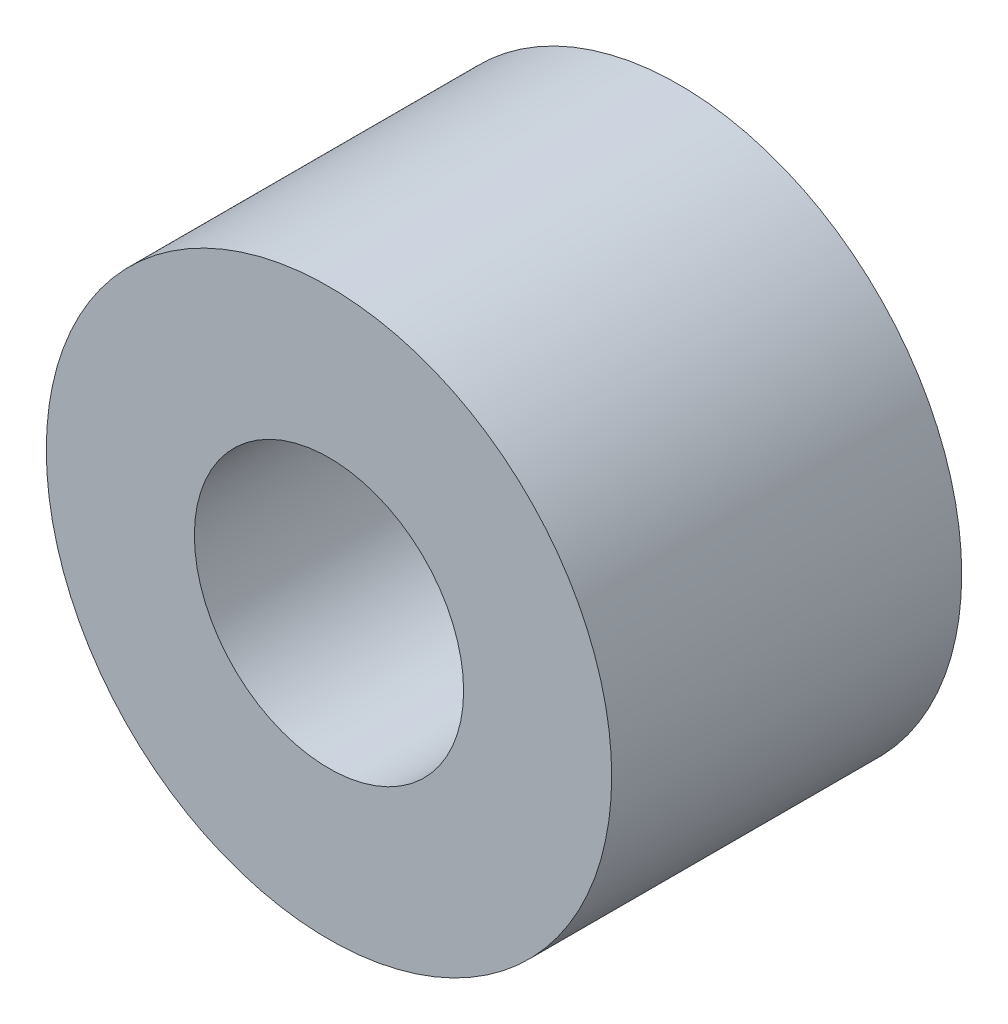
ISO-10303-21;
HEADER;
FILE_DESCRIPTION(('STEP AP214'),'2;1');
FILE_NAME('part.step','',(''),(''),'','','');
FILE_SCHEMA(('AUTOMOTIVE_DESIGN { 1 0 10303 214 1 1 1 1 }'));
ENDSEC;
DATA;
#1=APPLICATION_CONTEXT('core data for automotive mechanical design processes');
#2=APPLICATION_PROTOCOL_DEFINITION('international standard','automotive_design',2000,#1);
#3=PRODUCT_CONTEXT('',#1,'mechanical');
#4=PRODUCT('Part','Part','',(#3));
#5=PRODUCT_RELATED_PRODUCT_CATEGORY('part','',(#4));
#6=PRODUCT_DEFINITION_FORMATION('','',#4);
#7=PRODUCT_DEFINITION_CONTEXT('part definition',#1,'design');
#8=PRODUCT_DEFINITION('design','',#6,#7);
#9=PRODUCT_DEFINITION_SHAPE('','',#8);
#10=(LENGTH_UNIT() NAMED_UNIT(*) SI_UNIT(.MILLI.,.METRE.));
#11=(NAMED_UNIT(*) PLANE_ANGLE_UNIT() SI_UNIT($,.RADIAN.));
#12=(NAMED_UNIT(*) SI_UNIT($,.STERADIAN.) SOLID_ANGLE_UNIT());
#13=UNCERTAINTY_MEASURE_WITH_UNIT(LENGTH_MEASURE(1.E-05),#10,'distance_accuracy_value','');
#14=(GEOMETRIC_REPRESENTATION_CONTEXT(3) GLOBAL_UNCERTAINTY_ASSIGNED_CONTEXT((#13)) GLOBAL_UNIT_ASSIGNED_CONTEXT((#10,
#11,#12)) REPRESENTATION_CONTEXT('',''));
#15=CARTESIAN_POINT('',(0.,0.,0.));
#16=DIRECTION('',(0.,0.,1.));
#17=DIRECTION('',(1.,0.,0.));
#18=AXIS2_PLACEMENT_3D('',#15,#16,#17);
#19=CARTESIAN_POINT('',(0.,0.,26.));
#20=DIRECTION('',(0.,0.,1.));
#21=DIRECTION('',(1.,0.,0.));
#22=AXIS2_PLACEMENT_3D('',#19,#20,#21);
#23=PLANE('',#22);
#24=CARTESIAN_POINT('',(0.,0.,26.));
#25=DIRECTION('',(0.,0.,1.));
#26=DIRECTION('',(1.,0.,0.));
#27=AXIS2_PLACEMENT_3D('',#24,#25,#26);
#28=CIRCLE('',#27,21.);
#29=CARTESIAN_POINT('',(-21.,0.,26.));
#30=VERTEX_POINT('',#29);
#31=EDGE_CURVE('E10',#30,#30,#28,.T.);
#32=ORIENTED_EDGE('',*,*,#31,.T.);
#33=EDGE_LOOP('',(#32));
#34=FACE_BOUND('',#33,.T.);
#35=CARTESIAN_POINT('',(0.,0.,26.));
#36=DIRECTION('',(0.,0.,1.));
#37=DIRECTION('',(1.,0.,0.));
#38=AXIS2_PLACEMENT_3D('',#35,#36,#37);
#39=CIRCLE('',#38,10.);
#40=CARTESIAN_POINT('',(-10.,0.,26.));
#41=VERTEX_POINT('',#40);
#42=EDGE_CURVE('E41',#41,#41,#39,.T.);
#43=ORIENTED_EDGE('',*,*,#42,.F.);
#44=EDGE_LOOP('',(#43));
#45=FACE_BOUND('',#44,.T.);
#46=ADVANCED_FACE('F30',(#34,#45),#23,.T.);
#47=CARTESIAN_POINT('',(0.,0.,0.));
#48=DIRECTION('',(0.,0.,1.));
#49=DIRECTION('',(1.,0.,0.));
#50=AXIS2_PLACEMENT_3D('',#47,#48,#49);
#51=PLANE('',#50);
#52=CARTESIAN_POINT('',(0.,0.,0.));
#53=DIRECTION('',(0.,0.,1.));
#54=DIRECTION('',(1.,0.,0.));
#55=AXIS2_PLACEMENT_3D('',#52,#53,#54);
#56=CIRCLE('',#55,21.);
#57=CARTESIAN_POINT('',(-21.,0.,0.));
#58=VERTEX_POINT('',#57);
#59=EDGE_CURVE('E34',#58,#58,#56,.T.);
#60=ORIENTED_EDGE('',*,*,#59,.F.);
#61=EDGE_LOOP('',(#60));
#62=FACE_BOUND('',#61,.T.);
#63=CARTESIAN_POINT('',(0.,0.,0.));
#64=DIRECTION('',(0.,0.,1.));
#65=DIRECTION('',(1.,0.,0.));
#66=AXIS2_PLACEMENT_3D('',#63,#64,#65);
#67=CIRCLE('',#66,10.);
#68=CARTESIAN_POINT('',(-10.,0.,0.));
#69=VERTEX_POINT('',#68);
#70=EDGE_CURVE('E43',#69,#69,#67,.T.);
#71=ORIENTED_EDGE('',*,*,#70,.T.);
#72=EDGE_LOOP('',(#71));
#73=FACE_BOUND('',#72,.T.);
#74=ADVANCED_FACE('F53',(#62,#73),#51,.F.);
#75=CARTESIAN_POINT('',(0.,0.,26.));
#76=DIRECTION('',(0.,0.,-1.));
#77=DIRECTION('',(-1.,0.,0.));
#78=AXIS2_PLACEMENT_3D('',#75,#76,#77);
#79=CYLINDRICAL_SURFACE('',#78,21.);
#80=CARTESIAN_POINT('',(-21.,0.,26.));
#81=CARTESIAN_POINT('',(-21.,0.,25.7291666666667));
#82=CARTESIAN_POINT('',(-21.,0.,25.4583333333333));
#83=CARTESIAN_POINT('',(-21.,0.,24.9166666666667));
#84=CARTESIAN_POINT('',(-21.,0.,24.6458333333333));
#85=CARTESIAN_POINT('',(-21.,0.,24.1041666666667));
#86=CARTESIAN_POINT('',(-21.,0.,23.8333333333333));
#87=CARTESIAN_POINT('',(-21.,0.,23.2916666666667));
#88=CARTESIAN_POINT('',(-21.,0.,23.0208333333333));
#89=CARTESIAN_POINT('',(-21.,0.,22.4791666666667));
#90=CARTESIAN_POINT('',(-21.,0.,22.2083333333333));
#91=CARTESIAN_POINT('',(-21.,0.,21.6666666666667));
#92=CARTESIAN_POINT('',(-21.,0.,21.3958333333333));
#93=CARTESIAN_POINT('',(-21.,0.,20.8541666666667));
#94=CARTESIAN_POINT('',(-21.,0.,20.5833333333333));
#95=CARTESIAN_POINT('',(-21.,0.,20.0416666666667));
#96=CARTESIAN_POINT('',(-21.,0.,19.7708333333333));
#97=CARTESIAN_POINT('',(-21.,0.,19.2291666666667));
#98=CARTESIAN_POINT('',(-21.,0.,18.9583333333333));
#99=CARTESIAN_POINT('',(-21.,0.,18.4166666666667));
#100=CARTESIAN_POINT('',(-21.,0.,18.1458333333333));
#101=CARTESIAN_POINT('',(-21.,0.,17.6041666666667));
#102=CARTESIAN_POINT('',(-21.,0.,17.3333333333333));
#103=CARTESIAN_POINT('',(-21.,0.,16.7916666666667));
#104=CARTESIAN_POINT('',(-21.,0.,16.5208333333333));
#105=CARTESIAN_POINT('',(-21.,0.,15.9791666666667));
#106=CARTESIAN_POINT('',(-21.,0.,15.7083333333333));
#107=CARTESIAN_POINT('',(-21.,0.,15.1666666666667));
#108=CARTESIAN_POINT('',(-21.,0.,14.8958333333333));
#109=CARTESIAN_POINT('',(-21.,0.,14.3541666666667));
#110=CARTESIAN_POINT('',(-21.,0.,14.0833333333333));
#111=CARTESIAN_POINT('',(-21.,0.,13.5416666666667));
#112=CARTESIAN_POINT('',(-21.,0.,13.2708333333333));
#113=CARTESIAN_POINT('',(-21.,0.,12.7291666666667));
#114=CARTESIAN_POINT('',(-21.,0.,12.4583333333333));
#115=CARTESIAN_POINT('',(-21.,0.,11.9166666666667));
#116=CARTESIAN_POINT('',(-21.,0.,11.6458333333333));
#117=CARTESIAN_POINT('',(-21.,0.,11.1041666666667));
#118=CARTESIAN_POINT('',(-21.,0.,10.8333333333333));
#119=CARTESIAN_POINT('',(-21.,0.,10.2916666666667));
#120=CARTESIAN_POINT('',(-21.,0.,10.0208333333333));
#121=CARTESIAN_POINT('',(-21.,0.,9.47916666666667));
#122=CARTESIAN_POINT('',(-21.,0.,9.20833333333333));
#123=CARTESIAN_POINT('',(-21.,0.,8.66666666666667));
#124=CARTESIAN_POINT('',(-21.,0.,8.39583333333333));
#125=CARTESIAN_POINT('',(-21.,0.,7.85416666666667));
#126=CARTESIAN_POINT('',(-21.,0.,7.58333333333333));
#127=CARTESIAN_POINT('',(-21.,0.,7.04166666666667));
#128=CARTESIAN_POINT('',(-21.,0.,6.77083333333333));
#129=CARTESIAN_POINT('',(-21.,0.,6.22916666666667));
#130=CARTESIAN_POINT('',(-21.,0.,5.95833333333333));
#131=CARTESIAN_POINT('',(-21.,0.,5.41666666666667));
#132=CARTESIAN_POINT('',(-21.,0.,5.14583333333333));
#133=CARTESIAN_POINT('',(-21.,0.,4.60416666666667));
#134=CARTESIAN_POINT('',(-21.,0.,4.33333333333333));
#135=CARTESIAN_POINT('',(-21.,0.,3.79166666666667));
#136=CARTESIAN_POINT('',(-21.,0.,3.52083333333333));
#137=CARTESIAN_POINT('',(-21.,0.,2.97916666666667));
#138=CARTESIAN_POINT('',(-21.,0.,2.70833333333333));
#139=CARTESIAN_POINT('',(-21.,0.,2.16666666666667));
#140=CARTESIAN_POINT('',(-21.,0.,1.89583333333333));
#141=CARTESIAN_POINT('',(-21.,0.,1.35416666666667));
#142=CARTESIAN_POINT('',(-21.,0.,1.08333333333333));
#143=CARTESIAN_POINT('',(-21.,0.,0.541666666666667));
#144=CARTESIAN_POINT('',(-21.,0.,0.270833333333334));
#145=CARTESIAN_POINT('',(-21.,0.,0.));
#146=B_SPLINE_CURVE_WITH_KNOTS('',3,(#80,#81,#82,#83,#84,#85,#86,#87,#88,#89,#90,#91,#92,#93,
#94,#95,#96,#97,#98,#99,#100,#101,#102,#103,#104,#105,#106,#107,#108,#109,#110,#111,#112,#113,
#114,#115,#116,#117,#118,#119,#120,#121,#122,#123,#124,#125,#126,#127,#128,#129,#130,#131,#132,
#133,#134,#135,#136,#137,#138,#139,#140,#141,#142,#143,#144,#145),.UNSPECIFIED.,.F.,.F.,(4,2,2,
2,2,2,2,2,2,2,2,2,2,2,2,2,2,2,2,2,2,2,2,2,2,2,2,2,2,2,2,2,4),(0.,0.812499999999997,1.625,2.4375,
3.25,4.0625,4.875,5.6875,6.5,7.3125,8.125,8.93749999999999,9.74999999999999,10.5625,11.375,
12.1875,13.,13.8125,14.625,15.4375,16.25,17.0625,17.875,18.6875,19.5,20.3125,21.125,21.9375,
22.75,23.5625,24.375,25.1875,26.),.UNSPECIFIED.);
#147=EDGE_CURVE('BSEAM32',#30,#58,#146,.T.);
#148=ORIENTED_EDGE('',*,*,#31,.F.);
#149=ORIENTED_EDGE('',*,*,#59,.T.);
#150=ORIENTED_EDGE('',*,*,#147,.T.);
#151=ORIENTED_EDGE('',*,*,#147,.F.);
#152=EDGE_LOOP('',(#148,#150,#149,#151));
#153=FACE_BOUND('',#152,.T.);
#154=ADVANCED_FACE('F32',(#153),#79,.T.);
#155=CARTESIAN_POINT('',(0.,0.,26.));
#156=DIRECTION('',(0.,0.,-1.));
#157=DIRECTION('',(-1.,0.,0.));
#158=AXIS2_PLACEMENT_3D('',#155,#156,#157);
#159=CYLINDRICAL_SURFACE('',#158,10.);
#160=CARTESIAN_POINT('',(-10.,0.,26.));
#161=CARTESIAN_POINT('',(-10.,0.,25.7291666666667));
#162=CARTESIAN_POINT('',(-10.,0.,25.4583333333333));
#163=CARTESIAN_POINT('',(-10.,0.,24.9166666666667));
#164=CARTESIAN_POINT('',(-10.,0.,24.6458333333333));
#165=CARTESIAN_POINT('',(-10.,0.,24.1041666666667));
#166=CARTESIAN_POINT('',(-10.,0.,23.8333333333333));
#167=CARTESIAN_POINT('',(-10.,0.,23.2916666666667));
#168=CARTESIAN_POINT('',(-10.,0.,23.0208333333333));
#169=CARTESIAN_POINT('',(-10.,0.,22.4791666666667));
#170=CARTESIAN_POINT('',(-10.,0.,22.2083333333333));
#171=CARTESIAN_POINT('',(-10.,0.,21.6666666666667));
#172=CARTESIAN_POINT('',(-10.,0.,21.3958333333333));
#173=CARTESIAN_POINT('',(-10.,0.,20.8541666666667));
#174=CARTESIAN_POINT('',(-10.,0.,20.5833333333333));
#175=CARTESIAN_POINT('',(-10.,0.,20.0416666666667));
#176=CARTESIAN_POINT('',(-10.,0.,19.7708333333333));
#177=CARTESIAN_POINT('',(-10.,0.,19.2291666666667));
#178=CARTESIAN_POINT('',(-10.,0.,18.9583333333333));
#179=CARTESIAN_POINT('',(-10.,0.,18.4166666666667));
#180=CARTESIAN_POINT('',(-10.,0.,18.1458333333333));
#181=CARTESIAN_POINT('',(-10.,0.,17.6041666666667));
#182=CARTESIAN_POINT('',(-10.,0.,17.3333333333333));
#183=CARTESIAN_POINT('',(-10.,0.,16.7916666666667));
#184=CARTESIAN_POINT('',(-10.,0.,16.5208333333333));
#185=CARTESIAN_POINT('',(-10.,0.,15.9791666666667));
#186=CARTESIAN_POINT('',(-10.,0.,15.7083333333333));
#187=CARTESIAN_POINT('',(-10.,0.,15.1666666666667));
#188=CARTESIAN_POINT('',(-10.,0.,14.8958333333333));
#189=CARTESIAN_POINT('',(-10.,0.,14.3541666666667));
#190=CARTESIAN_POINT('',(-10.,0.,14.0833333333333));
#191=CARTESIAN_POINT('',(-10.,0.,13.5416666666667));
#192=CARTESIAN_POINT('',(-10.,0.,13.2708333333333));
#193=CARTESIAN_POINT('',(-10.,0.,12.7291666666667));
#194=CARTESIAN_POINT('',(-10.,0.,12.4583333333333));
#195=CARTESIAN_POINT('',(-10.,0.,11.9166666666667));
#196=CARTESIAN_POINT('',(-10.,0.,11.6458333333333));
#197=CARTESIAN_POINT('',(-10.,0.,11.1041666666667));
#198=CARTESIAN_POINT('',(-10.,0.,10.8333333333333));
#199=CARTESIAN_POINT('',(-10.,0.,10.2916666666667));
#200=CARTESIAN_POINT('',(-10.,0.,10.0208333333333));
#201=CARTESIAN_POINT('',(-10.,0.,9.47916666666667));
#202=CARTESIAN_POINT('',(-10.,0.,9.20833333333333));
#203=CARTESIAN_POINT('',(-10.,0.,8.66666666666667));
#204=CARTESIAN_POINT('',(-10.,0.,8.39583333333333));
#205=CARTESIAN_POINT('',(-10.,0.,7.85416666666667));
#206=CARTESIAN_POINT('',(-10.,0.,7.58333333333333));
#207=CARTESIAN_POINT('',(-10.,0.,7.04166666666667));
#208=CARTESIAN_POINT('',(-10.,0.,6.77083333333333));
#209=CARTESIAN_POINT('',(-10.,0.,6.22916666666667));
#210=CARTESIAN_POINT('',(-10.,0.,5.95833333333333));
#211=CARTESIAN_POINT('',(-10.,0.,5.41666666666667));
#212=CARTESIAN_POINT('',(-10.,0.,5.14583333333333));
#213=CARTESIAN_POINT('',(-10.,0.,4.60416666666667));
#214=CARTESIAN_POINT('',(-10.,0.,4.33333333333333));
#215=CARTESIAN_POINT('',(-10.,0.,3.79166666666667));
#216=CARTESIAN_POINT('',(-10.,0.,3.52083333333333));
#217=CARTESIAN_POINT('',(-10.,0.,2.97916666666667));
#218=CARTESIAN_POINT('',(-10.,0.,2.70833333333333));
#219=CARTESIAN_POINT('',(-10.,0.,2.16666666666667));
#220=CARTESIAN_POINT('',(-10.,0.,1.89583333333333));
#221=CARTESIAN_POINT('',(-10.,0.,1.35416666666667));
#222=CARTESIAN_POINT('',(-10.,0.,1.08333333333333));
#223=CARTESIAN_POINT('',(-10.,0.,0.541666666666667));
#224=CARTESIAN_POINT('',(-10.,0.,0.270833333333334));
#225=CARTESIAN_POINT('',(-10.,0.,0.));
#226=B_SPLINE_CURVE_WITH_KNOTS('',3,(#160,#161,#162,#163,#164,#165,#166,#167,#168,#169,#170,
#171,#172,#173,#174,#175,#176,#177,#178,#179,#180,#181,#182,#183,#184,#185,#186,#187,#188,#189,
#190,#191,#192,#193,#194,#195,#196,#197,#198,#199,#200,#201,#202,#203,#204,#205,#206,#207,#208,
#209,#210,#211,#212,#213,#214,#215,#216,#217,#218,#219,#220,#221,#222,#223,#224,#225),
.UNSPECIFIED.,.F.,.F.,(4,2,2,2,2,2,2,2,2,2,2,2,2,2,2,2,2,2,2,2,2,2,2,2,2,2,2,2,2,2,2,2,4),(0.,
0.812499999999997,1.625,2.4375,3.25,4.0625,4.875,5.6875,6.5,7.3125,8.125,8.93749999999999,
9.74999999999999,10.5625,11.375,12.1875,13.,13.8125,14.625,15.4375,16.25,17.0625,17.875,18.6875,
19.5,20.3125,21.125,21.9375,22.75,23.5625,24.375,25.1875,26.),.UNSPECIFIED.);
#227=EDGE_CURVE('BSEAM49',#41,#69,#226,.T.);
#228=ORIENTED_EDGE('',*,*,#42,.T.);
#229=ORIENTED_EDGE('',*,*,#70,.F.);
#230=ORIENTED_EDGE('',*,*,#227,.T.);
#231=ORIENTED_EDGE('',*,*,#227,.F.);
#232=EDGE_LOOP('',(#228,#230,#229,#231));
#233=FACE_BOUND('',#232,.T.);
#234=ADVANCED_FACE('F49',(#233),#159,.F.);
#235=CLOSED_SHELL('',(#46,#74,#154,#234));
#236=MANIFOLD_SOLID_BREP('B2',#235);
#237=ADVANCED_BREP_SHAPE_REPRESENTATION('',(#18,#236),#14);
#238=SHAPE_DEFINITION_REPRESENTATION(#9,#237);
ENDSEC;
END-ISO-10303-21;
